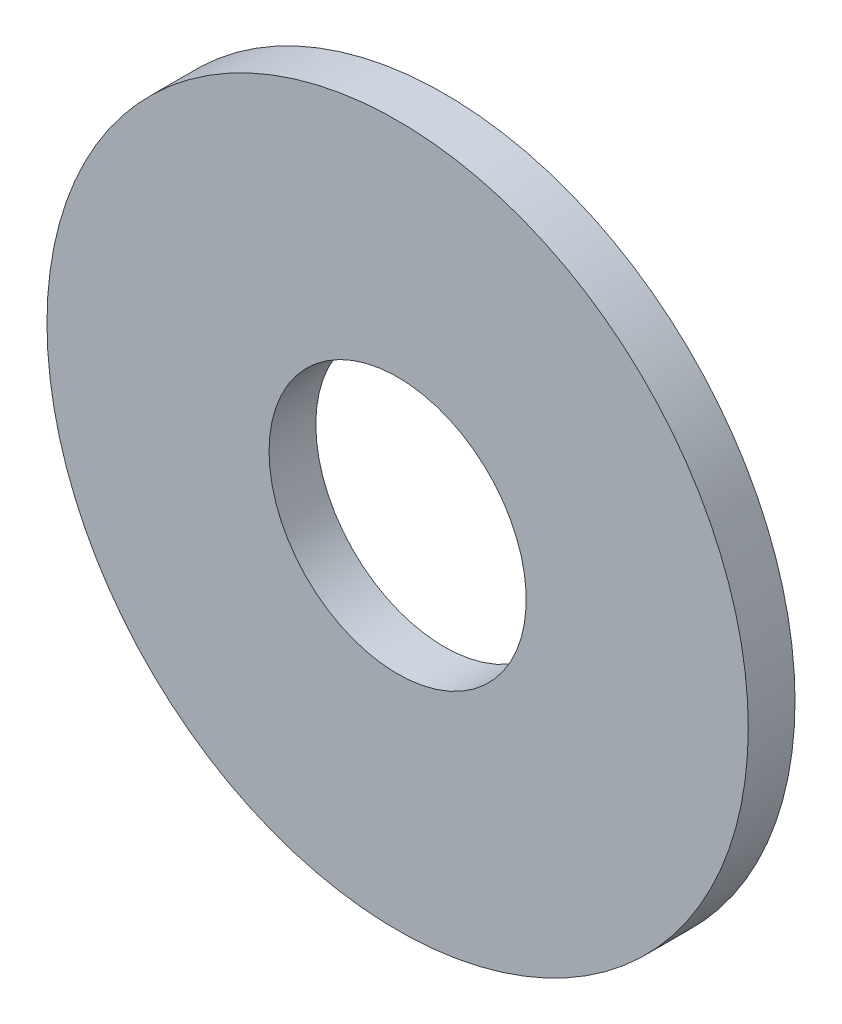
ISO-10303-21;
HEADER;
FILE_DESCRIPTION(('STEP AP214'),'2;1');
FILE_NAME('part.step','',(''),(''),'','','');
FILE_SCHEMA(('AUTOMOTIVE_DESIGN { 1 0 10303 214 1 1 1 1 }'));
ENDSEC;
DATA;
#1=APPLICATION_CONTEXT('core data for automotive mechanical design processes');
#2=APPLICATION_PROTOCOL_DEFINITION('international standard','automotive_design',2000,#1);
#3=PRODUCT_CONTEXT('',#1,'mechanical');
#4=PRODUCT('Part','Part','',(#3));
#5=PRODUCT_RELATED_PRODUCT_CATEGORY('part','',(#4));
#6=PRODUCT_DEFINITION_FORMATION('','',#4);
#7=PRODUCT_DEFINITION_CONTEXT('part definition',#1,'design');
#8=PRODUCT_DEFINITION('design','',#6,#7);
#9=PRODUCT_DEFINITION_SHAPE('','',#8);
#10=(LENGTH_UNIT() NAMED_UNIT(*) SI_UNIT(.MILLI.,.METRE.));
#11=(NAMED_UNIT(*) PLANE_ANGLE_UNIT() SI_UNIT($,.RADIAN.));
#12=(NAMED_UNIT(*) SI_UNIT($,.STERADIAN.) SOLID_ANGLE_UNIT());
#13=UNCERTAINTY_MEASURE_WITH_UNIT(LENGTH_MEASURE(1.E-05),#10,'distance_accuracy_value','');
#14=(GEOMETRIC_REPRESENTATION_CONTEXT(3) GLOBAL_UNCERTAINTY_ASSIGNED_CONTEXT((#13)) GLOBAL_UNIT_ASSIGNED_CONTEXT((#10,
#11,#12)) REPRESENTATION_CONTEXT('',''));
#15=CARTESIAN_POINT('',(0.,0.,0.));
#16=DIRECTION('',(0.,0.,1.));
#17=DIRECTION('',(1.,0.,0.));
#18=AXIS2_PLACEMENT_3D('',#15,#16,#17);
#19=CARTESIAN_POINT('',(-194.682629871368,-400.102297195527,-792.485796357671));
#20=DIRECTION('',(0.,0.,1.));
#21=DIRECTION('',(1.,0.,0.));
#22=AXIS2_PLACEMENT_3D('',#19,#20,#21);
#23=PLANE('',#22);
#24=CARTESIAN_POINT('',(-194.682629871368,-420.602297195527,-792.485796357671));
#25=DIRECTION('',(0.,0.,-1.));
#26=DIRECTION('',(-1.,0.,0.));
#27=AXIS2_PLACEMENT_3D('',#24,#25,#26);
#28=CIRCLE('',#27,11.);
#29=CARTESIAN_POINT('',(-205.682629871368,-420.602297195527,-792.485796357671));
#30=VERTEX_POINT('',#29);
#31=EDGE_CURVE('E27',#30,#30,#28,.T.);
#32=ORIENTED_EDGE('',*,*,#31,.T.);
#33=EDGE_LOOP('',(#32));
#34=FACE_BOUND('',#33,.T.);
#35=CARTESIAN_POINT('',(-194.682629871368,-420.602297195527,-792.485796357671));
#36=DIRECTION('',(0.,0.,-1.));
#37=DIRECTION('',(-1.,0.,0.));
#38=AXIS2_PLACEMENT_3D('',#35,#36,#37);
#39=CIRCLE('',#38,29.9999999999999);
#40=CARTESIAN_POINT('',(-224.682629871368,-420.602297195527,-792.485796357671));
#41=VERTEX_POINT('',#40);
#42=EDGE_CURVE('E18',#41,#41,#39,.T.);
#43=ORIENTED_EDGE('',*,*,#42,.F.);
#44=EDGE_LOOP('',(#43));
#45=FACE_BOUND('',#44,.T.);
#46=ADVANCED_FACE('F15',(#34,#45),#23,.T.);
#47=CARTESIAN_POINT('',(-194.682629871368,-420.602297195527,-794.485796357673));
#48=DIRECTION('',(0.,0.,-1.));
#49=DIRECTION('',(-1.,0.,0.));
#50=AXIS2_PLACEMENT_3D('',#47,#48,#49);
#51=CYLINDRICAL_SURFACE('',#50,29.9999999999999);
#52=ORIENTED_EDGE('',*,*,#42,.T.);
#53=EDGE_LOOP('',(#52));
#54=FACE_BOUND('',#53,.T.);
#55=CARTESIAN_POINT('',(-194.682629871368,-420.602297195527,-796.485796357672));
#56=DIRECTION('',(0.,0.,-1.));
#57=DIRECTION('',(-1.,0.,0.));
#58=AXIS2_PLACEMENT_3D('',#55,#56,#57);
#59=CIRCLE('',#58,29.9999999999999);
#60=CARTESIAN_POINT('',(-224.682629871368,-420.602297195527,-796.485796357672));
#61=VERTEX_POINT('',#60);
#62=EDGE_CURVE('E22',#61,#61,#59,.T.);
#63=ORIENTED_EDGE('',*,*,#62,.F.);
#64=EDGE_LOOP('',(#63));
#65=FACE_BOUND('',#64,.T.);
#66=ADVANCED_FACE('F35',(#54,#65),#51,.T.);
#67=CARTESIAN_POINT('',(-194.682629871368,-420.602297195527,-794.485796357673));
#68=DIRECTION('',(0.,0.,-1.));
#69=DIRECTION('',(-1.,0.,0.));
#70=AXIS2_PLACEMENT_3D('',#67,#68,#69);
#71=CYLINDRICAL_SURFACE('',#70,11.);
#72=CARTESIAN_POINT('',(-194.682629871368,-420.602297195527,-796.485796357672));
#73=DIRECTION('',(0.,0.,-1.));
#74=DIRECTION('',(-1.,0.,0.));
#75=AXIS2_PLACEMENT_3D('',#72,#73,#74);
#76=CIRCLE('',#75,11.);
#77=CARTESIAN_POINT('',(-205.682629871368,-420.602297195527,-796.485796357672));
#78=VERTEX_POINT('',#77);
#79=EDGE_CURVE('E10',#78,#78,#76,.F.);
#80=ORIENTED_EDGE('',*,*,#79,.F.);
#81=EDGE_LOOP('',(#80));
#82=FACE_BOUND('',#81,.T.);
#83=ORIENTED_EDGE('',*,*,#31,.F.);
#84=EDGE_LOOP('',(#83));
#85=FACE_BOUND('',#84,.T.);
#86=ADVANCED_FACE('F43',(#82,#85),#71,.F.);
#87=CARTESIAN_POINT('',(-194.682629871368,-400.102297195527,-796.485796357672));
#88=DIRECTION('',(0.,0.,-1.));
#89=DIRECTION('',(-1.,0.,0.));
#90=AXIS2_PLACEMENT_3D('',#87,#88,#89);
#91=PLANE('',#90);
#92=ORIENTED_EDGE('',*,*,#79,.T.);
#93=EDGE_LOOP('',(#92));
#94=FACE_BOUND('',#93,.T.);
#95=ORIENTED_EDGE('',*,*,#62,.T.);
#96=EDGE_LOOP('',(#95));
#97=FACE_BOUND('',#96,.T.);
#98=ADVANCED_FACE('F44',(#94,#97),#91,.T.);
#99=CLOSED_SHELL('',(#46,#66,#86,#98));
#100=MANIFOLD_SOLID_BREP('B1',#99);
#101=ADVANCED_BREP_SHAPE_REPRESENTATION('',(#18,#100),#14);
#102=SHAPE_DEFINITION_REPRESENTATION(#9,#101);
ENDSEC;
END-ISO-10303-21;
